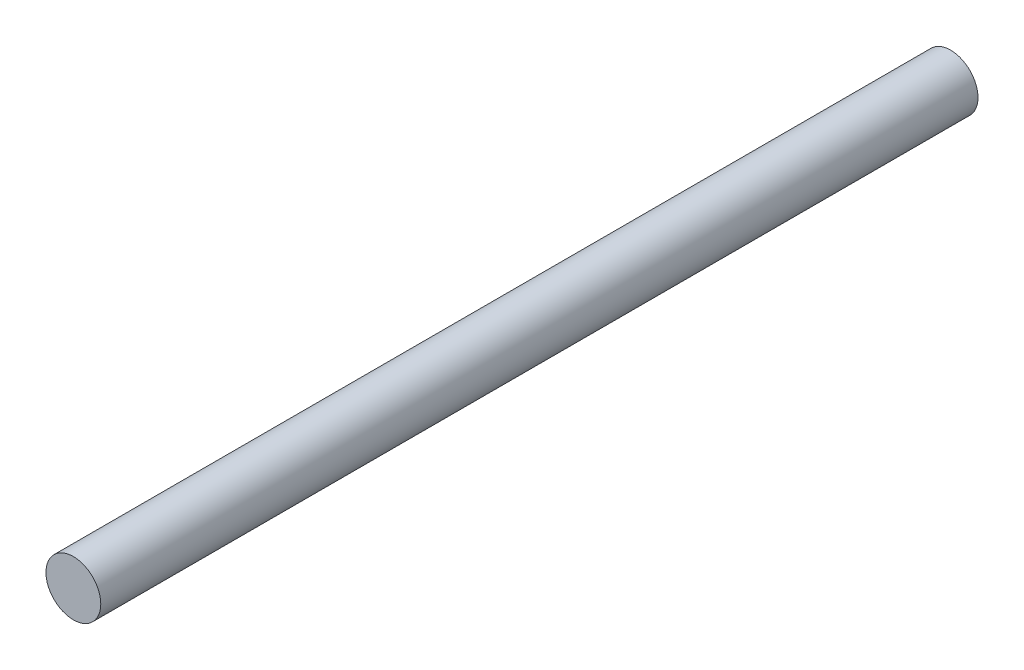
ISO-10303-21;
HEADER;
FILE_DESCRIPTION(('STEP AP214'),'2;1');
FILE_NAME('part.step','',(''),(''),'','','');
FILE_SCHEMA(('AUTOMOTIVE_DESIGN { 1 0 10303 214 1 1 1 1 }'));
ENDSEC;
DATA;
#1=APPLICATION_CONTEXT('core data for automotive mechanical design processes');
#2=APPLICATION_PROTOCOL_DEFINITION('international standard','automotive_design',2000,#1);
#3=PRODUCT_CONTEXT('',#1,'mechanical');
#4=PRODUCT('Part','Part','',(#3));
#5=PRODUCT_RELATED_PRODUCT_CATEGORY('part','',(#4));
#6=PRODUCT_DEFINITION_FORMATION('','',#4);
#7=PRODUCT_DEFINITION_CONTEXT('part definition',#1,'design');
#8=PRODUCT_DEFINITION('design','',#6,#7);
#9=PRODUCT_DEFINITION_SHAPE('','',#8);
#10=(LENGTH_UNIT() NAMED_UNIT(*) SI_UNIT(.MILLI.,.METRE.));
#11=(NAMED_UNIT(*) PLANE_ANGLE_UNIT() SI_UNIT($,.RADIAN.));
#12=(NAMED_UNIT(*) SI_UNIT($,.STERADIAN.) SOLID_ANGLE_UNIT());
#13=UNCERTAINTY_MEASURE_WITH_UNIT(LENGTH_MEASURE(1.E-05),#10,'distance_accuracy_value','');
#14=(GEOMETRIC_REPRESENTATION_CONTEXT(3) GLOBAL_UNCERTAINTY_ASSIGNED_CONTEXT((#13)) GLOBAL_UNIT_ASSIGNED_CONTEXT((#10,
#11,#12)) REPRESENTATION_CONTEXT('',''));
#15=CARTESIAN_POINT('',(0.,0.,0.));
#16=DIRECTION('',(0.,0.,1.));
#17=DIRECTION('',(1.,0.,0.));
#18=AXIS2_PLACEMENT_3D('',#15,#16,#17);
#19=CARTESIAN_POINT('',(0.,0.,24.));
#20=DIRECTION('',(0.,0.,-1.));
#21=DIRECTION('',(-1.,0.,0.));
#22=AXIS2_PLACEMENT_3D('',#19,#20,#21);
#23=CYLINDRICAL_SURFACE('',#22,0.75);
#24=CARTESIAN_POINT('',(0.,0.,24.));
#25=DIRECTION('',(0.,0.,1.));
#26=DIRECTION('',(1.,0.,0.));
#27=AXIS2_PLACEMENT_3D('',#24,#25,#26);
#28=CIRCLE('',#27,0.75);
#29=CARTESIAN_POINT('',(0.75,0.,24.));
#30=VERTEX_POINT('',#29);
#31=EDGE_CURVE('E10',#30,#30,#28,.T.);
#32=ORIENTED_EDGE('',*,*,#31,.F.);
#33=EDGE_LOOP('',(#32));
#34=FACE_BOUND('',#33,.T.);
#35=CARTESIAN_POINT('',(0.,0.,0.));
#36=DIRECTION('',(0.,0.,1.));
#37=DIRECTION('',(1.,0.,0.));
#38=AXIS2_PLACEMENT_3D('',#35,#36,#37);
#39=CIRCLE('',#38,0.75);
#40=CARTESIAN_POINT('',(0.75,0.,0.));
#41=VERTEX_POINT('',#40);
#42=EDGE_CURVE('E40',#41,#41,#39,.T.);
#43=ORIENTED_EDGE('',*,*,#42,.T.);
#44=EDGE_LOOP('',(#43));
#45=FACE_BOUND('',#44,.T.);
#46=ADVANCED_FACE('F37',(#34,#45),#23,.T.);
#47=CARTESIAN_POINT('',(0.,0.,24.));
#48=DIRECTION('',(0.,0.,1.));
#49=DIRECTION('',(1.,0.,0.));
#50=AXIS2_PLACEMENT_3D('',#47,#48,#49);
#51=PLANE('',#50);
#52=ORIENTED_EDGE('',*,*,#31,.T.);
#53=EDGE_LOOP('',(#52));
#54=FACE_BOUND('',#53,.T.);
#55=ADVANCED_FACE('F54',(#54),#51,.T.);
#56=CARTESIAN_POINT('',(0.,0.,0.));
#57=DIRECTION('',(0.,0.,1.));
#58=DIRECTION('',(1.,0.,0.));
#59=AXIS2_PLACEMENT_3D('',#56,#57,#58);
#60=PLANE('',#59);
#61=ORIENTED_EDGE('',*,*,#42,.F.);
#62=EDGE_LOOP('',(#61));
#63=FACE_BOUND('',#62,.T.);
#64=ADVANCED_FACE('F52',(#63),#60,.F.);
#65=CLOSED_SHELL('',(#46,#55,#64));
#66=MANIFOLD_SOLID_BREP('B2',#65);
#67=ADVANCED_BREP_SHAPE_REPRESENTATION('',(#18,#66),#14);
#68=SHAPE_DEFINITION_REPRESENTATION(#9,#67);
ENDSEC;
END-ISO-10303-21;
